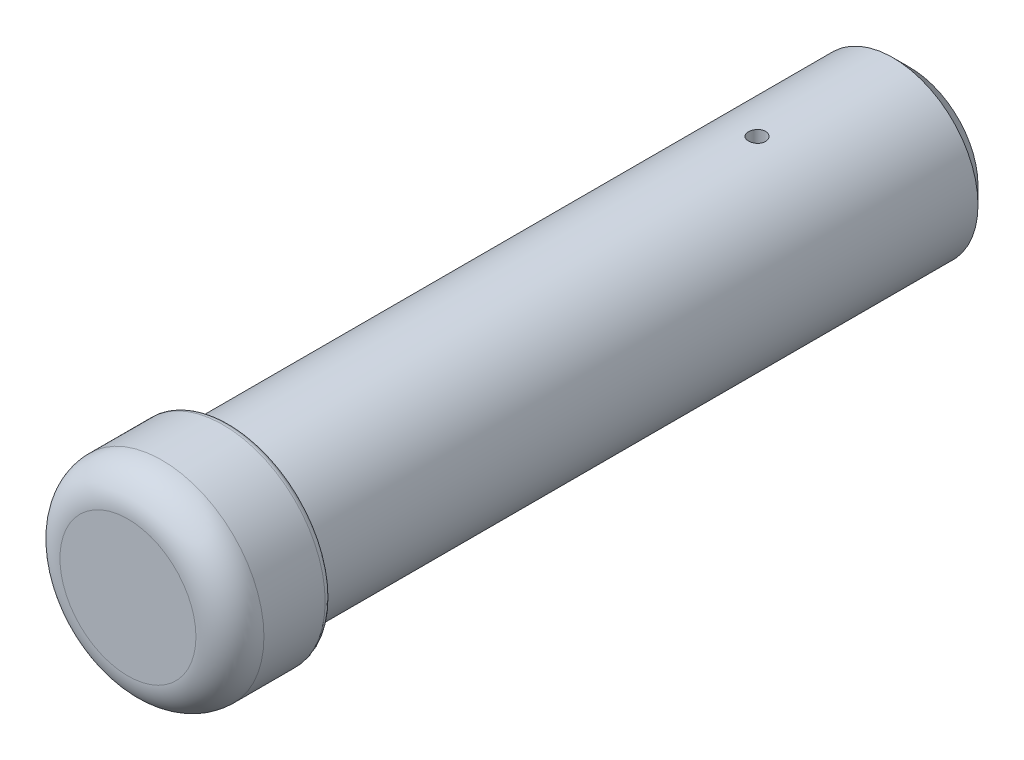
ISO-10303-21;
HEADER;
FILE_DESCRIPTION(('STEP AP214'),'2;1');
FILE_NAME('part.step','',(''),(''),'','','');
FILE_SCHEMA(('AUTOMOTIVE_DESIGN { 1 0 10303 214 1 1 1 1 }'));
ENDSEC;
DATA;
#1=APPLICATION_CONTEXT('core data for automotive mechanical design processes');
#2=APPLICATION_PROTOCOL_DEFINITION('international standard','automotive_design',2000,#1);
#3=PRODUCT_CONTEXT('',#1,'mechanical');
#4=PRODUCT('Part','Part','',(#3));
#5=PRODUCT_RELATED_PRODUCT_CATEGORY('part','',(#4));
#6=PRODUCT_DEFINITION_FORMATION('','',#4);
#7=PRODUCT_DEFINITION_CONTEXT('part definition',#1,'design');
#8=PRODUCT_DEFINITION('design','',#6,#7);
#9=PRODUCT_DEFINITION_SHAPE('','',#8);
#10=(LENGTH_UNIT() NAMED_UNIT(*) SI_UNIT(.MILLI.,.METRE.));
#11=(NAMED_UNIT(*) PLANE_ANGLE_UNIT() SI_UNIT($,.RADIAN.));
#12=(NAMED_UNIT(*) SI_UNIT($,.STERADIAN.) SOLID_ANGLE_UNIT());
#13=UNCERTAINTY_MEASURE_WITH_UNIT(LENGTH_MEASURE(1.E-05),#10,'distance_accuracy_value','');
#14=(GEOMETRIC_REPRESENTATION_CONTEXT(3) GLOBAL_UNCERTAINTY_ASSIGNED_CONTEXT((#13)) GLOBAL_UNIT_ASSIGNED_CONTEXT((#10,
#11,#12)) REPRESENTATION_CONTEXT('',''));
#15=CARTESIAN_POINT('',(0.,0.,0.));
#16=DIRECTION('',(0.,0.,1.));
#17=DIRECTION('',(1.,0.,0.));
#18=AXIS2_PLACEMENT_3D('',#15,#16,#17);
#19=CARTESIAN_POINT('',(0.,0.,200.));
#20=DIRECTION('',(0.,0.,-1.));
#21=DIRECTION('',(-1.,0.,0.));
#22=AXIS2_PLACEMENT_3D('',#19,#20,#21);
#23=CYLINDRICAL_SURFACE('',#22,25.);
#24=CARTESIAN_POINT('',(0.,-25.,47.5));
#25=CARTESIAN_POINT('',(0.140050884478893,-24.9999983880192,47.4999939352491));
#26=CARTESIAN_POINT('',(0.280194362919433,-24.9988106399051,47.4881918277589));
#27=CARTESIAN_POINT('',(0.556595996242093,-24.9941866898684,47.4412890742739));
#28=CARTESIAN_POINT('',(0.69284969792207,-24.9907480108506,47.4061627599385));
#29=CARTESIAN_POINT('',(0.957429188633535,-24.9820103640768,47.3136443985054));
#30=CARTESIAN_POINT('',(1.08575971153727,-24.9767125200177,47.2562657987038));
#31=CARTESIAN_POINT('',(1.33094040240102,-24.9648489348577,47.1208977301709));
#32=CARTESIAN_POINT('',(1.44779284694769,-24.9582834459533,47.0429123599997));
#33=CARTESIAN_POINT('',(1.6671488766852,-24.9445936085331,46.8682432558443));
#34=CARTESIAN_POINT('',(1.76960536208723,-24.9374675393466,46.7715005014949));
#35=CARTESIAN_POINT('',(1.95685630357746,-24.9234739226566,46.5621886643424));
#36=CARTESIAN_POINT('',(2.04164994270663,-24.9166063871229,46.449618849894));
#37=CARTESIAN_POINT('',(2.19133492610904,-24.9038897888196,46.211553670791));
#38=CARTESIAN_POINT('',(2.2561836636372,-24.8980429177726,46.0860313897629));
#39=CARTESIAN_POINT('',(2.3638659618569,-24.8880509386631,45.8258110352376));
#40=CARTESIAN_POINT('',(2.40670006647823,-24.8839057885556,45.6911131885401));
#41=CARTESIAN_POINT('',(2.46899760400474,-24.8778021018244,45.416845497835));
#42=CARTESIAN_POINT('',(2.48853913250949,-24.8758362599524,45.2772935578695));
#43=CARTESIAN_POINT('',(2.5039382128384,-24.8742910765131,44.9968778415106));
#44=CARTESIAN_POINT('',(2.49979638717701,-24.8747116722186,44.8560140996949));
#45=CARTESIAN_POINT('',(2.4680107006317,-24.8778851724734,44.5775117257667));
#46=CARTESIAN_POINT('',(2.44045211031138,-24.8806296147663,44.4398632516783));
#47=CARTESIAN_POINT('',(2.36274786037647,-24.8881283571855,44.1711550919973));
#48=CARTESIAN_POINT('',(2.31260189563937,-24.8928826844623,44.0400954954374));
#49=CARTESIAN_POINT('',(2.19105223470377,-24.9038752363018,43.7880160317528));
#50=CARTESIAN_POINT('',(2.11961070679995,-24.9101160977039,43.6670145262767));
#51=CARTESIAN_POINT('',(1.95752506838307,-24.923376293322,43.4386869627203));
#52=CARTESIAN_POINT('',(1.86688039584127,-24.9303956503196,43.3313613050456));
#53=CARTESIAN_POINT('',(1.66848528103018,-24.9444596328247,43.1329365150274));
#54=CARTESIAN_POINT('',(1.56066119712841,-24.9515042333249,43.041910995298));
#55=CARTESIAN_POINT('',(1.33122370434278,-24.964795726963,42.879240917724));
#56=CARTESIAN_POINT('',(1.209610279999,-24.9710426192064,42.8075963816088));
#57=CARTESIAN_POINT('',(0.95599526423091,-24.9820368916774,42.6857249492244));
#58=CARTESIAN_POINT('',(0.823991865974758,-24.9867840103692,42.6355017879548));
#59=CARTESIAN_POINT('',(0.55336804332483,-24.9942411860352,42.5579527082206));
#60=CARTESIAN_POINT('',(0.414747816941501,-24.9969513039266,42.5306261050234));
#61=CARTESIAN_POINT('',(0.135462747729759,-25.0000212917078,42.4997392306631));
#62=CARTESIAN_POINT('',(-0.00519075526372983,-25.0003912066934,42.4960773793687));
#63=CARTESIAN_POINT('',(-0.285109483289249,-24.9987660439199,42.5123571576219));
#64=CARTESIAN_POINT('',(-0.424374727051175,-24.9967709981117,42.5322984682882));
#65=CARTESIAN_POINT('',(-0.697270517086687,-24.9906465384799,42.5951342385539));
#66=CARTESIAN_POINT('',(-0.830912122430049,-24.986521547951,42.637981136195));
#67=CARTESIAN_POINT('',(-1.08911080345946,-24.9765999715152,42.7453629350932));
#68=CARTESIAN_POINT('',(-1.21366767539279,-24.9708033481313,42.8098983225985));
#69=CARTESIAN_POINT('',(-1.45062045043036,-24.9581618832606,42.9590770966598));
#70=CARTESIAN_POINT('',(-1.56297414937229,-24.951313590086,43.0437872223145));
#71=CARTESIAN_POINT('',(-1.7719040582797,-24.937348321738,43.2308151693523));
#72=CARTESIAN_POINT('',(-1.86847987212294,-24.9302313398243,43.3331334326758));
#73=CARTESIAN_POINT('',(-2.04346527471786,-24.9165006035189,43.5529164366475));
#74=CARTESIAN_POINT('',(-2.12180819669886,-24.9098887534744,43.6704343913566));
#75=CARTESIAN_POINT('',(-2.25764564685957,-24.8979458115222,43.9170184003667));
#76=CARTESIAN_POINT('',(-2.31514046013471,-24.8926147021009,44.046084296721));
#77=CARTESIAN_POINT('',(-2.40753802171119,-24.8838486908512,44.3118718486645));
#78=CARTESIAN_POINT('',(-2.44248043702965,-24.8804104612447,44.4485796002278));
#79=CARTESIAN_POINT('',(-2.48891001782366,-24.8758091320719,44.7259579949019));
#80=CARTESIAN_POINT('',(-2.50039785599879,-24.8746459672547,44.8666285242392));
#81=CARTESIAN_POINT('',(-2.49958284617814,-24.8747278276891,45.1472767208918));
#82=CARTESIAN_POINT('',(-2.48738472398278,-24.8759622521752,45.287254707207));
#83=CARTESIAN_POINT('',(-2.43976363240913,-24.8806775972386,45.5631622929207));
#84=CARTESIAN_POINT('',(-2.4043406369054,-24.884158520343,45.699091887765));
#85=CARTESIAN_POINT('',(-2.31130421574376,-24.8929717065797,45.9630433726196));
#86=CARTESIAN_POINT('',(-2.25369386085229,-24.898303713509,46.0910663540743));
#87=CARTESIAN_POINT('',(-2.11792888727761,-24.910218795984,46.3356422291776));
#88=CARTESIAN_POINT('',(-2.03977438363854,-24.9168018645238,46.4521951870516));
#89=CARTESIAN_POINT('',(-1.86474639071333,-24.9305121802424,46.6710591861798));
#90=CARTESIAN_POINT('',(-1.76779487222567,-24.9376416181688,46.7733076909177));
#91=CARTESIAN_POINT('',(-1.55807924806277,-24.9516213682196,46.9601305817492));
#92=CARTESIAN_POINT('',(-1.44531136027064,-24.9584716130744,47.0447007283929));
#93=CARTESIAN_POINT('',(-1.20685358540322,-24.971139051729,47.1939336346366));
#94=CARTESIAN_POINT('',(-1.08113187336691,-24.9769536006703,47.258545727363));
#95=CARTESIAN_POINT('',(-0.820645697751378,-24.9868657312474,47.3656560570597));
#96=CARTESIAN_POINT('',(-0.685891624564025,-24.9909652477413,47.4081792273839));
#97=CARTESIAN_POINT('',(-0.458645653514262,-24.9959553443433,47.459301542712));
#98=CARTESIAN_POINT('',(-0.367606382111273,-24.9974650172958,47.4745426107484));
#99=CARTESIAN_POINT('',(-0.184391452043282,-24.9994878737697,47.4948938151544));
#100=CARTESIAN_POINT('',(-0.0922157980663945,-25.0000010614006,47.5000039933047));
#101=CARTESIAN_POINT('',(0.,-25.,47.5));
#102=B_SPLINE_CURVE_WITH_KNOTS('',3,(#24,#25,#26,#27,#28,#29,#30,#31,#32,#33,#34,#35,#36,#37,
#38,#39,#40,#41,#42,#43,#44,#45,#46,#47,#48,#49,#50,#51,#52,#53,#54,#55,#56,#57,#58,#59,#60,#61,
#62,#63,#64,#65,#66,#67,#68,#69,#70,#71,#72,#73,#74,#75,#76,#77,#78,#79,#80,#81,#82,#83,#84,#85,
#86,#87,#88,#89,#90,#91,#92,#93,#94,#95,#96,#97,#98,#99,#100,#101),.UNSPECIFIED.,.T.,.F.,(4,2,2,
2,2,2,2,2,2,2,2,2,2,2,2,2,2,2,2,2,2,2,2,2,2,2,2,2,2,2,2,2,2,2,2,2,2,2,4),(0.,0.419815915671185,
0.840094607088716,1.2601197143305,1.68006134395695,2.10134642155736,2.52265098051765,
2.94484938680555,3.3670373610626,3.78780580112991,4.20856318139442,4.62779493602776,
5.04703235404085,5.46701903432237,5.88701800827814,6.30886835490517,6.7307191744943,
7.15264351733955,7.57455524188599,7.99465471519395,8.41474851297859,8.83397338235763,
9.25320765123668,9.67384851871746,10.0944999452558,10.516666090215,10.9388264618844,
11.3602422648251,11.7816459809896,12.2011907323489,12.620735955651,13.04022313407,
13.459707963474,13.8809729356914,14.302338815924,14.7247657756561,15.1467148698824,
15.4231416808087,15.6995673517257),.UNSPECIFIED.);
#103=CARTESIAN_POINT('',(0.,-25.,47.5));
#104=VERTEX_POINT('',#103);
#105=EDGE_CURVE('E37',#104,#104,#102,.T.);
#106=ORIENTED_EDGE('',*,*,#105,.T.);
#107=EDGE_LOOP('',(#106));
#108=FACE_BOUND('',#107,.T.);
#109=CARTESIAN_POINT('',(0.,25.,47.5));
#110=CARTESIAN_POINT('',(-0.140050884478893,24.9999983880192,47.4999939352491));
#111=CARTESIAN_POINT('',(-0.280194362919433,24.9988106399051,47.4881918277589));
#112=CARTESIAN_POINT('',(-0.556595996242093,24.9941866898684,47.4412890742739));
#113=CARTESIAN_POINT('',(-0.69284969792207,24.9907480108506,47.4061627599385));
#114=CARTESIAN_POINT('',(-0.957429188633535,24.9820103640768,47.3136443985054));
#115=CARTESIAN_POINT('',(-1.08575971153727,24.9767125200177,47.2562657987038));
#116=CARTESIAN_POINT('',(-1.33094040240102,24.9648489348577,47.1208977301709));
#117=CARTESIAN_POINT('',(-1.44779284694769,24.9582834459533,47.0429123599997));
#118=CARTESIAN_POINT('',(-1.6671488766852,24.9445936085331,46.8682432558443));
#119=CARTESIAN_POINT('',(-1.76960536208723,24.9374675393466,46.7715005014949));
#120=CARTESIAN_POINT('',(-1.95685630357746,24.9234739226566,46.5621886643424));
#121=CARTESIAN_POINT('',(-2.04164994270663,24.9166063871229,46.449618849894));
#122=CARTESIAN_POINT('',(-2.19133492610904,24.9038897888196,46.211553670791));
#123=CARTESIAN_POINT('',(-2.2561836636372,24.8980429177726,46.0860313897629));
#124=CARTESIAN_POINT('',(-2.3638659618569,24.8880509386631,45.8258110352376));
#125=CARTESIAN_POINT('',(-2.40670006647823,24.8839057885556,45.6911131885401));
#126=CARTESIAN_POINT('',(-2.46899760400474,24.8778021018244,45.416845497835));
#127=CARTESIAN_POINT('',(-2.48853913250949,24.8758362599524,45.2772935578695));
#128=CARTESIAN_POINT('',(-2.5039382128384,24.8742910765131,44.9968778415106));
#129=CARTESIAN_POINT('',(-2.49979638717701,24.8747116722186,44.8560140996949));
#130=CARTESIAN_POINT('',(-2.4680107006317,24.8778851724734,44.5775117257667));
#131=CARTESIAN_POINT('',(-2.44045211031138,24.8806296147663,44.4398632516783));
#132=CARTESIAN_POINT('',(-2.36274786037647,24.8881283571855,44.1711550919973));
#133=CARTESIAN_POINT('',(-2.31260189563937,24.8928826844623,44.0400954954374));
#134=CARTESIAN_POINT('',(-2.19105223470377,24.9038752363018,43.7880160317528));
#135=CARTESIAN_POINT('',(-2.11961070679995,24.9101160977039,43.6670145262767));
#136=CARTESIAN_POINT('',(-1.95752506838307,24.923376293322,43.4386869627203));
#137=CARTESIAN_POINT('',(-1.86688039584127,24.9303956503196,43.3313613050456));
#138=CARTESIAN_POINT('',(-1.66848528103018,24.9444596328247,43.1329365150274));
#139=CARTESIAN_POINT('',(-1.56066119712841,24.9515042333249,43.041910995298));
#140=CARTESIAN_POINT('',(-1.33122370434278,24.964795726963,42.879240917724));
#141=CARTESIAN_POINT('',(-1.209610279999,24.9710426192064,42.8075963816088));
#142=CARTESIAN_POINT('',(-0.95599526423091,24.9820368916774,42.6857249492244));
#143=CARTESIAN_POINT('',(-0.823991865974758,24.9867840103692,42.6355017879548));
#144=CARTESIAN_POINT('',(-0.55336804332483,24.9942411860352,42.5579527082206));
#145=CARTESIAN_POINT('',(-0.414747816941501,24.9969513039266,42.5306261050234));
#146=CARTESIAN_POINT('',(-0.135462747729759,25.0000212917078,42.4997392306631));
#147=CARTESIAN_POINT('',(0.00519075526372983,25.0003912066934,42.4960773793687));
#148=CARTESIAN_POINT('',(0.285109483289249,24.9987660439199,42.5123571576219));
#149=CARTESIAN_POINT('',(0.424374727051175,24.9967709981117,42.5322984682882));
#150=CARTESIAN_POINT('',(0.697270517086687,24.9906465384799,42.5951342385539));
#151=CARTESIAN_POINT('',(0.830912122430049,24.986521547951,42.637981136195));
#152=CARTESIAN_POINT('',(1.08911080345946,24.9765999715152,42.7453629350932));
#153=CARTESIAN_POINT('',(1.21366767539279,24.9708033481313,42.8098983225985));
#154=CARTESIAN_POINT('',(1.45062045043036,24.9581618832606,42.9590770966598));
#155=CARTESIAN_POINT('',(1.56297414937229,24.951313590086,43.0437872223145));
#156=CARTESIAN_POINT('',(1.7719040582797,24.937348321738,43.2308151693523));
#157=CARTESIAN_POINT('',(1.86847987212294,24.9302313398243,43.3331334326758));
#158=CARTESIAN_POINT('',(2.04346527471786,24.9165006035189,43.5529164366475));
#159=CARTESIAN_POINT('',(2.12180819669886,24.9098887534744,43.6704343913566));
#160=CARTESIAN_POINT('',(2.25764564685957,24.8979458115222,43.9170184003667));
#161=CARTESIAN_POINT('',(2.31514046013471,24.8926147021009,44.046084296721));
#162=CARTESIAN_POINT('',(2.40753802171119,24.8838486908512,44.3118718486645));
#163=CARTESIAN_POINT('',(2.44248043702965,24.8804104612447,44.4485796002278));
#164=CARTESIAN_POINT('',(2.48891001782366,24.8758091320719,44.7259579949019));
#165=CARTESIAN_POINT('',(2.50039785599879,24.8746459672547,44.8666285242392));
#166=CARTESIAN_POINT('',(2.49958284617814,24.8747278276891,45.1472767208918));
#167=CARTESIAN_POINT('',(2.48738472398278,24.8759622521752,45.287254707207));
#168=CARTESIAN_POINT('',(2.43976363240913,24.8806775972386,45.5631622929207));
#169=CARTESIAN_POINT('',(2.4043406369054,24.884158520343,45.699091887765));
#170=CARTESIAN_POINT('',(2.31130421574376,24.8929717065797,45.9630433726196));
#171=CARTESIAN_POINT('',(2.25369386085229,24.898303713509,46.0910663540743));
#172=CARTESIAN_POINT('',(2.11792888727761,24.910218795984,46.3356422291776));
#173=CARTESIAN_POINT('',(2.03977438363854,24.9168018645238,46.4521951870516));
#174=CARTESIAN_POINT('',(1.86474639071333,24.9305121802424,46.6710591861798));
#175=CARTESIAN_POINT('',(1.76779487222567,24.9376416181688,46.7733076909177));
#176=CARTESIAN_POINT('',(1.55807924806277,24.9516213682196,46.9601305817492));
#177=CARTESIAN_POINT('',(1.44531136027064,24.9584716130744,47.0447007283929));
#178=CARTESIAN_POINT('',(1.20685358540322,24.971139051729,47.1939336346366));
#179=CARTESIAN_POINT('',(1.08113187336691,24.9769536006703,47.258545727363));
#180=CARTESIAN_POINT('',(0.820645697751378,24.9868657312474,47.3656560570597));
#181=CARTESIAN_POINT('',(0.685891624564025,24.9909652477413,47.4081792273839));
#182=CARTESIAN_POINT('',(0.458645653514262,24.9959553443433,47.459301542712));
#183=CARTESIAN_POINT('',(0.367606382111273,24.9974650172958,47.4745426107484));
#184=CARTESIAN_POINT('',(0.184391452043282,24.9994878737697,47.4948938151544));
#185=CARTESIAN_POINT('',(0.0922157980663945,25.0000010614006,47.5000039933047));
#186=CARTESIAN_POINT('',(0.,25.,47.5));
#187=B_SPLINE_CURVE_WITH_KNOTS('',3,(#109,#110,#111,#112,#113,#114,#115,#116,#117,#118,#119,
#120,#121,#122,#123,#124,#125,#126,#127,#128,#129,#130,#131,#132,#133,#134,#135,#136,#137,#138,
#139,#140,#141,#142,#143,#144,#145,#146,#147,#148,#149,#150,#151,#152,#153,#154,#155,#156,#157,
#158,#159,#160,#161,#162,#163,#164,#165,#166,#167,#168,#169,#170,#171,#172,#173,#174,#175,#176,
#177,#178,#179,#180,#181,#182,#183,#184,#185,#186),.UNSPECIFIED.,.T.,.F.,(4,2,2,2,2,2,2,2,2,2,2,
2,2,2,2,2,2,2,2,2,2,2,2,2,2,2,2,2,2,2,2,2,2,2,2,2,2,2,4),(0.,0.419815915671185,
0.840094607088716,1.2601197143305,1.68006134395695,2.10134642155736,2.52265098051765,
2.94484938680555,3.3670373610626,3.78780580112991,4.20856318139442,4.62779493602776,
5.04703235404085,5.46701903432237,5.88701800827814,6.30886835490517,6.7307191744943,
7.15264351733955,7.57455524188599,7.99465471519395,8.41474851297859,8.83397338235763,
9.25320765123668,9.67384851871746,10.0944999452558,10.516666090215,10.9388264618844,
11.3602422648251,11.7816459809896,12.2011907323489,12.620735955651,13.04022313407,
13.459707963474,13.8809729356914,14.302338815924,14.7247657756561,15.1467148698824,
15.4231416808087,15.6995673517257),.UNSPECIFIED.);
#188=CARTESIAN_POINT('',(0.,25.,47.5));
#189=VERTEX_POINT('',#188);
#190=EDGE_CURVE('E54',#189,#189,#187,.T.);
#191=ORIENTED_EDGE('',*,*,#190,.T.);
#192=EDGE_LOOP('',(#191));
#193=FACE_BOUND('',#192,.T.);
#194=CARTESIAN_POINT('',(0.,0.,5.));
#195=DIRECTION('',(0.,0.,1.));
#196=DIRECTION('',(1.,0.,0.));
#197=AXIS2_PLACEMENT_3D('',#194,#195,#196);
#198=CIRCLE('',#197,25.);
#199=CARTESIAN_POINT('',(25.,0.,5.));
#200=VERTEX_POINT('',#199);
#201=EDGE_CURVE('E46',#200,#200,#198,.T.);
#202=ORIENTED_EDGE('',*,*,#201,.T.);
#203=EDGE_LOOP('',(#202));
#204=FACE_BOUND('',#203,.T.);
#205=CARTESIAN_POINT('',(0.,0.,198.));
#206=DIRECTION('',(0.,0.,1.));
#207=DIRECTION('',(1.,0.,0.));
#208=AXIS2_PLACEMENT_3D('',#205,#206,#207);
#209=CIRCLE('',#208,25.);
#210=CARTESIAN_POINT('',(25.,0.,198.));
#211=VERTEX_POINT('',#210);
#212=EDGE_CURVE('E51',#211,#211,#209,.F.);
#213=ORIENTED_EDGE('',*,*,#212,.T.);
#214=EDGE_LOOP('',(#213));
#215=FACE_BOUND('',#214,.T.);
#216=ADVANCED_FACE('F32',(#108,#193,#204,#215),#23,.T.);
#217=CARTESIAN_POINT('',(0.,0.,0.));
#218=DIRECTION('',(0.,0.,1.));
#219=DIRECTION('',(1.,0.,0.));
#220=AXIS2_PLACEMENT_3D('',#217,#218,#219);
#221=PLANE('',#220);
#222=CARTESIAN_POINT('',(0.,0.,0.));
#223=DIRECTION('',(0.,0.,1.));
#224=DIRECTION('',(1.,0.,0.));
#225=AXIS2_PLACEMENT_3D('',#222,#223,#224);
#226=CIRCLE('',#225,20.);
#227=CARTESIAN_POINT('',(20.,0.,0.));
#228=VERTEX_POINT('',#227);
#229=EDGE_CURVE('E10',#228,#228,#226,.F.);
#230=ORIENTED_EDGE('',*,*,#229,.T.);
#231=EDGE_LOOP('',(#230));
#232=FACE_BOUND('',#231,.T.);
#233=ADVANCED_FACE('F79',(#232),#221,.F.);
#234=CARTESIAN_POINT('',(0.,0.,230.));
#235=DIRECTION('',(0.,0.,-1.));
#236=DIRECTION('',(-1.,0.,0.));
#237=AXIS2_PLACEMENT_3D('',#234,#235,#236);
#238=CYLINDRICAL_SURFACE('',#237,30.);
#239=CARTESIAN_POINT('',(0.,0.,202.));
#240=DIRECTION('',(0.,0.,1.));
#241=DIRECTION('',(1.,0.,0.));
#242=AXIS2_PLACEMENT_3D('',#239,#240,#241);
#243=CIRCLE('',#242,30.);
#244=CARTESIAN_POINT('',(30.,0.,202.));
#245=VERTEX_POINT('',#244);
#246=EDGE_CURVE('E105',#245,#245,#243,.T.);
#247=ORIENTED_EDGE('',*,*,#246,.T.);
#248=EDGE_LOOP('',(#247));
#249=FACE_BOUND('',#248,.T.);
#250=CARTESIAN_POINT('',(0.,0.,220.));
#251=DIRECTION('',(0.,0.,1.));
#252=DIRECTION('',(1.,0.,0.));
#253=AXIS2_PLACEMENT_3D('',#250,#251,#252);
#254=CIRCLE('',#253,30.);
#255=CARTESIAN_POINT('',(30.,0.,220.));
#256=VERTEX_POINT('',#255);
#257=EDGE_CURVE('E108',#256,#256,#254,.F.);
#258=ORIENTED_EDGE('',*,*,#257,.T.);
#259=EDGE_LOOP('',(#258));
#260=FACE_BOUND('',#259,.T.);
#261=ADVANCED_FACE('F72',(#249,#260),#238,.T.);
#262=CARTESIAN_POINT('',(0.,0.,230.));
#263=DIRECTION('',(0.,0.,1.));
#264=DIRECTION('',(1.,0.,0.));
#265=AXIS2_PLACEMENT_3D('',#262,#263,#264);
#266=PLANE('',#265);
#267=CARTESIAN_POINT('',(0.,0.,230.));
#268=DIRECTION('',(0.,0.,1.));
#269=DIRECTION('',(1.,0.,0.));
#270=AXIS2_PLACEMENT_3D('',#267,#268,#269);
#271=CIRCLE('',#270,20.);
#272=CARTESIAN_POINT('',(20.,0.,230.));
#273=VERTEX_POINT('',#272);
#274=EDGE_CURVE('E111',#273,#273,#271,.T.);
#275=ORIENTED_EDGE('',*,*,#274,.T.);
#276=EDGE_LOOP('',(#275));
#277=FACE_BOUND('',#276,.T.);
#278=ADVANCED_FACE('F67',(#277),#266,.T.);
#279=CARTESIAN_POINT('',(0.,0.,200.));
#280=DIRECTION('',(0.,0.,1.));
#281=DIRECTION('',(1.,0.,0.));
#282=AXIS2_PLACEMENT_3D('',#279,#280,#281);
#283=PLANE('',#282);
#284=CARTESIAN_POINT('',(0.,0.,200.));
#285=DIRECTION('',(0.,0.,1.));
#286=DIRECTION('',(1.,0.,0.));
#287=AXIS2_PLACEMENT_3D('',#284,#285,#286);
#288=CIRCLE('',#287,28.);
#289=CARTESIAN_POINT('',(28.,0.,200.));
#290=VERTEX_POINT('',#289);
#291=EDGE_CURVE('E98',#290,#290,#288,.F.);
#292=ORIENTED_EDGE('',*,*,#291,.T.);
#293=EDGE_LOOP('',(#292));
#294=FACE_BOUND('',#293,.T.);
#295=CARTESIAN_POINT('',(0.,0.,200.));
#296=DIRECTION('',(0.,0.,1.));
#297=DIRECTION('',(1.,0.,0.));
#298=AXIS2_PLACEMENT_3D('',#295,#296,#297);
#299=CIRCLE('',#298,27.);
#300=CARTESIAN_POINT('',(27.,0.,200.));
#301=VERTEX_POINT('',#300);
#302=EDGE_CURVE('E100',#301,#301,#299,.T.);
#303=ORIENTED_EDGE('',*,*,#302,.T.);
#304=EDGE_LOOP('',(#303));
#305=FACE_BOUND('',#304,.T.);
#306=ADVANCED_FACE('F71',(#294,#305),#283,.F.);
#307=CARTESIAN_POINT('',(0.,0.,220.));
#308=DIRECTION('',(0.,0.,1.));
#309=DIRECTION('',(1.,0.,0.));
#310=AXIS2_PLACEMENT_3D('',#307,#308,#309);
#311=TOROIDAL_SURFACE('',#310,20.,10.);
#312=ORIENTED_EDGE('',*,*,#257,.F.);
#313=EDGE_LOOP('',(#312));
#314=FACE_BOUND('',#313,.T.);
#315=ORIENTED_EDGE('',*,*,#274,.F.);
#316=EDGE_LOOP('',(#315));
#317=FACE_BOUND('',#316,.T.);
#318=ADVANCED_FACE('F76',(#314,#317),#311,.T.);
#319=CARTESIAN_POINT('',(0.,0.,202.));
#320=DIRECTION('',(0.,0.,1.));
#321=DIRECTION('',(1.,0.,0.));
#322=AXIS2_PLACEMENT_3D('',#319,#320,#321);
#323=TOROIDAL_SURFACE('',#322,28.,2.);
#324=ORIENTED_EDGE('',*,*,#291,.F.);
#325=EDGE_LOOP('',(#324));
#326=FACE_BOUND('',#325,.T.);
#327=ORIENTED_EDGE('',*,*,#246,.F.);
#328=EDGE_LOOP('',(#327));
#329=FACE_BOUND('',#328,.T.);
#330=ADVANCED_FACE('F116',(#326,#329),#323,.T.);
#331=CARTESIAN_POINT('',(0.,0.,198.));
#332=DIRECTION('',(0.,0.,1.));
#333=DIRECTION('',(1.,0.,0.));
#334=AXIS2_PLACEMENT_3D('',#331,#332,#333);
#335=TOROIDAL_SURFACE('',#334,27.,2.);
#336=ORIENTED_EDGE('',*,*,#212,.F.);
#337=EDGE_LOOP('',(#336));
#338=FACE_BOUND('',#337,.T.);
#339=ORIENTED_EDGE('',*,*,#302,.F.);
#340=EDGE_LOOP('',(#339));
#341=FACE_BOUND('',#340,.T.);
#342=ADVANCED_FACE('F121',(#338,#341),#335,.F.);
#343=CARTESIAN_POINT('',(0.,0.,5.));
#344=DIRECTION('',(0.,0.,1.));
#345=DIRECTION('',(1.,0.,0.));
#346=AXIS2_PLACEMENT_3D('',#343,#344,#345);
#347=CONICAL_SURFACE('',#346,25.,0.785398163397449);
#348=ORIENTED_EDGE('',*,*,#229,.F.);
#349=EDGE_LOOP('',(#348));
#350=FACE_BOUND('',#349,.T.);
#351=ORIENTED_EDGE('',*,*,#201,.F.);
#352=EDGE_LOOP('',(#351));
#353=FACE_BOUND('',#352,.T.);
#354=ADVANCED_FACE('F35',(#350,#353),#347,.T.);
#355=CARTESIAN_POINT('',(0.,-30.,45.));
#356=DIRECTION('',(0.,1.,0.));
#357=DIRECTION('',(0.,0.,1.));
#358=AXIS2_PLACEMENT_3D('',#355,#356,#357);
#359=CYLINDRICAL_SURFACE('',#358,2.5);
#360=ORIENTED_EDGE('',*,*,#190,.F.);
#361=EDGE_LOOP('',(#360));
#362=FACE_BOUND('',#361,.T.);
#363=ORIENTED_EDGE('',*,*,#105,.F.);
#364=EDGE_LOOP('',(#363));
#365=FACE_BOUND('',#364,.T.);
#366=ADVANCED_FACE('F62',(#362,#365),#359,.F.);
#367=CLOSED_SHELL('',(#216,#233,#261,#278,#306,#318,#330,#342,#354,#366));
#368=MANIFOLD_SOLID_BREP('B2',#367);
#369=ADVANCED_BREP_SHAPE_REPRESENTATION('',(#18,#368),#14);
#370=SHAPE_DEFINITION_REPRESENTATION(#9,#369);
ENDSEC;
END-ISO-10303-21;
